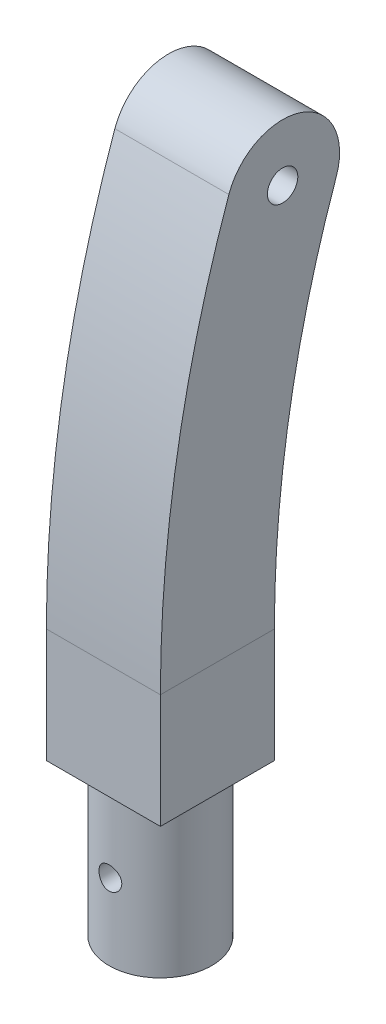
ISO-10303-21;
HEADER;
FILE_DESCRIPTION(('STEP AP214'),'2;1');
FILE_NAME('part.step','',(''),(''),'','','');
FILE_SCHEMA(('AUTOMOTIVE_DESIGN { 1 0 10303 214 1 1 1 1 }'));
ENDSEC;
DATA;
#1=APPLICATION_CONTEXT('core data for automotive mechanical design processes');
#2=APPLICATION_PROTOCOL_DEFINITION('international standard','automotive_design',2000,#1);
#3=PRODUCT_CONTEXT('',#1,'mechanical');
#4=PRODUCT('Part','Part','',(#3));
#5=PRODUCT_RELATED_PRODUCT_CATEGORY('part','',(#4));
#6=PRODUCT_DEFINITION_FORMATION('','',#4);
#7=PRODUCT_DEFINITION_CONTEXT('part definition',#1,'design');
#8=PRODUCT_DEFINITION('design','',#6,#7);
#9=PRODUCT_DEFINITION_SHAPE('','',#8);
#10=(LENGTH_UNIT() NAMED_UNIT(*) SI_UNIT(.MILLI.,.METRE.));
#11=(NAMED_UNIT(*) PLANE_ANGLE_UNIT() SI_UNIT($,.RADIAN.));
#12=(NAMED_UNIT(*) SI_UNIT($,.STERADIAN.) SOLID_ANGLE_UNIT());
#13=UNCERTAINTY_MEASURE_WITH_UNIT(LENGTH_MEASURE(1.E-05),#10,'distance_accuracy_value','');
#14=(GEOMETRIC_REPRESENTATION_CONTEXT(3) GLOBAL_UNCERTAINTY_ASSIGNED_CONTEXT((#13)) GLOBAL_UNIT_ASSIGNED_CONTEXT((#10,
#11,#12)) REPRESENTATION_CONTEXT('',''));
#15=CARTESIAN_POINT('',(0.,0.,0.));
#16=DIRECTION('',(0.,0.,1.));
#17=DIRECTION('',(1.,0.,0.));
#18=AXIS2_PLACEMENT_3D('',#15,#16,#17);
#19=CARTESIAN_POINT('',(0.,0.,0.));
#20=DIRECTION('',(0.,-1.,0.));
#21=DIRECTION('',(0.,0.,-1.));
#22=AXIS2_PLACEMENT_3D('',#19,#20,#21);
#23=PLANE('',#22);
#24=CARTESIAN_POINT('',(0.,0.,0.));
#25=DIRECTION('',(0.,-1.,0.));
#26=DIRECTION('',(0.,0.,-1.));
#27=AXIS2_PLACEMENT_3D('',#24,#25,#26);
#28=CIRCLE('',#27,13.5);
#29=CARTESIAN_POINT('',(0.,0.,-13.5));
#30=VERTEX_POINT('',#29);
#31=EDGE_CURVE('E11',#30,#30,#28,.T.);
#32=ORIENTED_EDGE('',*,*,#31,.F.);
#33=EDGE_LOOP('',(#32));
#34=FACE_BOUND('',#33,.T.);
#35=DIRECTION('',(0.,0.,-1.));
#36=VECTOR('',#35,1.);
#37=CARTESIAN_POINT('',(15.,0.,15.));
#38=LINE('',#37,#36);
#39=CARTESIAN_POINT('',(15.,0.,15.));
#40=VERTEX_POINT('',#39);
#41=CARTESIAN_POINT('',(15.,0.,-15.));
#42=VERTEX_POINT('',#41);
#43=EDGE_CURVE('E123',#40,#42,#38,.T.);
#44=ORIENTED_EDGE('',*,*,#43,.F.);
#45=DIRECTION('',(1.,0.,0.));
#46=VECTOR('',#45,1.);
#47=CARTESIAN_POINT('',(-15.,0.,15.));
#48=LINE('',#47,#46);
#49=CARTESIAN_POINT('',(-15.,0.,15.));
#50=VERTEX_POINT('',#49);
#51=EDGE_CURVE('E135',#50,#40,#48,.T.);
#52=ORIENTED_EDGE('',*,*,#51,.F.);
#53=DIRECTION('',(0.,0.,1.));
#54=VECTOR('',#53,1.);
#55=CARTESIAN_POINT('',(-15.,0.,15.));
#56=LINE('',#55,#54);
#57=CARTESIAN_POINT('',(-15.,0.,-15.));
#58=VERTEX_POINT('',#57);
#59=EDGE_CURVE('E88',#58,#50,#56,.T.);
#60=ORIENTED_EDGE('',*,*,#59,.F.);
#61=DIRECTION('',(-1.,0.,0.));
#62=VECTOR('',#61,1.);
#63=CARTESIAN_POINT('',(-15.,0.,-15.));
#64=LINE('',#63,#62);
#65=EDGE_CURVE('E92',#42,#58,#64,.T.);
#66=ORIENTED_EDGE('',*,*,#65,.F.);
#67=EDGE_LOOP('',(#44,#52,#60,#66));
#68=FACE_BOUND('',#67,.T.);
#69=ADVANCED_FACE('F33',(#34,#68),#23,.T.);
#70=CARTESIAN_POINT('',(15.,0.,15.));
#71=DIRECTION('',(1.,0.,0.));
#72=DIRECTION('',(0.,0.,-1.));
#73=AXIS2_PLACEMENT_3D('',#70,#71,#72);
#74=PLANE('',#73);
#75=DIRECTION('',(0.,1.,0.));
#76=VECTOR('',#75,1.);
#77=CARTESIAN_POINT('',(15.,0.,-15.));
#78=LINE('',#77,#76);
#79=CARTESIAN_POINT('',(15.,30.,-15.));
#80=VERTEX_POINT('',#79);
#81=EDGE_CURVE('E128',#42,#80,#78,.T.);
#82=ORIENTED_EDGE('',*,*,#81,.T.);
#83=DIRECTION('',(0.,0.,-1.));
#84=VECTOR('',#83,1.);
#85=CARTESIAN_POINT('',(15.,30.,15.));
#86=LINE('',#85,#84);
#87=CARTESIAN_POINT('',(15.,30.,15.));
#88=VERTEX_POINT('',#87);
#89=EDGE_CURVE('E126',#88,#80,#86,.T.);
#90=ORIENTED_EDGE('',*,*,#89,.F.);
#91=DIRECTION('',(0.,1.,0.));
#92=VECTOR('',#91,1.);
#93=CARTESIAN_POINT('',(15.,0.,15.));
#94=LINE('',#93,#92);
#95=EDGE_CURVE('E129',#40,#88,#94,.T.);
#96=ORIENTED_EDGE('',*,*,#95,.F.);
#97=ORIENTED_EDGE('',*,*,#43,.T.);
#98=EDGE_LOOP('',(#82,#90,#96,#97));
#99=FACE_BOUND('',#98,.T.);
#100=ADVANCED_FACE('F158',(#99),#74,.T.);
#101=CARTESIAN_POINT('',(-15.,0.,-15.));
#102=DIRECTION('',(0.,0.,-1.));
#103=DIRECTION('',(-1.,0.,0.));
#104=AXIS2_PLACEMENT_3D('',#101,#102,#103);
#105=PLANE('',#104);
#106=DIRECTION('',(0.,1.,0.));
#107=VECTOR('',#106,1.);
#108=CARTESIAN_POINT('',(-15.,0.,-15.));
#109=LINE('',#108,#107);
#110=CARTESIAN_POINT('',(-15.,30.,-15.));
#111=VERTEX_POINT('',#110);
#112=EDGE_CURVE('E140',#58,#111,#109,.T.);
#113=ORIENTED_EDGE('',*,*,#112,.T.);
#114=DIRECTION('',(-1.,0.,0.));
#115=VECTOR('',#114,1.);
#116=CARTESIAN_POINT('',(-15.,30.,-15.));
#117=LINE('',#116,#115);
#118=EDGE_CURVE('E132',#80,#111,#117,.T.);
#119=ORIENTED_EDGE('',*,*,#118,.F.);
#120=ORIENTED_EDGE('',*,*,#81,.F.);
#121=ORIENTED_EDGE('',*,*,#65,.T.);
#122=EDGE_LOOP('',(#113,#119,#120,#121));
#123=FACE_BOUND('',#122,.T.);
#124=ADVANCED_FACE('F161',(#123),#105,.T.);
#125=CARTESIAN_POINT('',(-15.,0.,15.));
#126=DIRECTION('',(-1.,0.,0.));
#127=DIRECTION('',(0.,0.,1.));
#128=AXIS2_PLACEMENT_3D('',#125,#126,#127);
#129=PLANE('',#128);
#130=DIRECTION('',(0.,1.,0.));
#131=VECTOR('',#130,1.);
#132=CARTESIAN_POINT('',(-15.,0.,15.));
#133=LINE('',#132,#131);
#134=CARTESIAN_POINT('',(-15.,30.,15.));
#135=VERTEX_POINT('',#134);
#136=EDGE_CURVE('E148',#50,#135,#133,.T.);
#137=ORIENTED_EDGE('',*,*,#136,.T.);
#138=DIRECTION('',(0.,0.,1.));
#139=VECTOR('',#138,1.);
#140=CARTESIAN_POINT('',(-15.,30.,15.));
#141=LINE('',#140,#139);
#142=EDGE_CURVE('E143',#111,#135,#141,.T.);
#143=ORIENTED_EDGE('',*,*,#142,.F.);
#144=ORIENTED_EDGE('',*,*,#112,.F.);
#145=ORIENTED_EDGE('',*,*,#59,.T.);
#146=EDGE_LOOP('',(#137,#143,#144,#145));
#147=FACE_BOUND('',#146,.T.);
#148=ADVANCED_FACE('F187',(#147),#129,.T.);
#149=CARTESIAN_POINT('',(-15.,0.,15.));
#150=DIRECTION('',(0.,0.,1.));
#151=DIRECTION('',(1.,0.,0.));
#152=AXIS2_PLACEMENT_3D('',#149,#150,#151);
#153=PLANE('',#152);
#154=DIRECTION('',(1.,0.,0.));
#155=VECTOR('',#154,1.);
#156=CARTESIAN_POINT('',(-15.,30.,15.));
#157=LINE('',#156,#155);
#158=EDGE_CURVE('E99',#135,#88,#157,.T.);
#159=ORIENTED_EDGE('',*,*,#158,.F.);
#160=ORIENTED_EDGE('',*,*,#136,.F.);
#161=ORIENTED_EDGE('',*,*,#51,.T.);
#162=ORIENTED_EDGE('',*,*,#95,.T.);
#163=EDGE_LOOP('',(#159,#160,#161,#162));
#164=FACE_BOUND('',#163,.T.);
#165=ADVANCED_FACE('F156',(#164),#153,.T.);
#166=CARTESIAN_POINT('',(15.,30.,15.));
#167=DIRECTION('',(1.,0.,0.));
#168=DIRECTION('',(0.,0.,-1.));
#169=AXIS2_PLACEMENT_3D('',#166,#167,#168);
#170=PLANE('',#169);
#171=CARTESIAN_POINT('',(15.,130.,-17.157287525381));
#172=DIRECTION('',(1.,0.,0.));
#173=DIRECTION('',(0.,0.,-1.));
#174=AXIS2_PLACEMENT_3D('',#171,#172,#173);
#175=CIRCLE('',#174,4.);
#176=CARTESIAN_POINT('',(15.,130.,-21.157287525381));
#177=VERTEX_POINT('',#176);
#178=EDGE_CURVE('E113',#177,#177,#175,.T.);
#179=ORIENTED_EDGE('',*,*,#178,.F.);
#180=EDGE_LOOP('',(#179));
#181=FACE_BOUND('',#180,.T.);
#182=CARTESIAN_POINT('',(15.,30.,-300.));
#183=DIRECTION('',(-1.,0.,0.));
#184=DIRECTION('',(0.,0.,1.));
#185=AXIS2_PLACEMENT_3D('',#182,#183,#184);
#186=CIRCLE('',#185,285.);
#187=CARTESIAN_POINT('',(15.,125.,-31.2994231491119));
#188=VERTEX_POINT('',#187);
#189=EDGE_CURVE('E78',#80,#188,#186,.T.);
#190=ORIENTED_EDGE('',*,*,#189,.T.);
#191=CARTESIAN_POINT('',(15.,130.,-17.157287525381));
#192=DIRECTION('',(1.,0.,0.));
#193=DIRECTION('',(0.,0.,-1.));
#194=AXIS2_PLACEMENT_3D('',#191,#192,#193);
#195=CIRCLE('',#194,15.);
#196=CARTESIAN_POINT('',(15.,135.,-3.01515190165003));
#197=VERTEX_POINT('',#196);
#198=EDGE_CURVE('E110',#188,#197,#195,.T.);
#199=ORIENTED_EDGE('',*,*,#198,.T.);
#200=CARTESIAN_POINT('',(15.,30.,-300.));
#201=DIRECTION('',(-1.,0.,0.));
#202=DIRECTION('',(0.,0.,1.));
#203=AXIS2_PLACEMENT_3D('',#200,#201,#202);
#204=CIRCLE('',#203,315.);
#205=EDGE_CURVE('E97',#88,#197,#204,.T.);
#206=ORIENTED_EDGE('',*,*,#205,.F.);
#207=ORIENTED_EDGE('',*,*,#89,.T.);
#208=EDGE_LOOP('',(#190,#199,#206,#207));
#209=FACE_BOUND('',#208,.T.);
#210=ADVANCED_FACE('F112',(#181,#209),#170,.T.);
#211=CARTESIAN_POINT('',(0.,30.,-300.));
#212=DIRECTION('',(-1.,0.,0.));
#213=DIRECTION('',(0.,0.,1.));
#214=AXIS2_PLACEMENT_3D('',#211,#212,#213);
#215=CYLINDRICAL_SURFACE('',#214,285.);
#216=CARTESIAN_POINT('',(-15.,30.,-300.));
#217=DIRECTION('',(-1.,0.,0.));
#218=DIRECTION('',(0.,0.,1.));
#219=AXIS2_PLACEMENT_3D('',#216,#217,#218);
#220=CIRCLE('',#219,285.);
#221=CARTESIAN_POINT('',(-15.,125.,-31.2994231491119));
#222=VERTEX_POINT('',#221);
#223=EDGE_CURVE('E56',#111,#222,#220,.T.);
#224=ORIENTED_EDGE('',*,*,#223,.T.);
#225=DIRECTION('',(-1.,0.,0.));
#226=VECTOR('',#225,1.);
#227=CARTESIAN_POINT('',(-15.,125.,-31.2994231491119));
#228=LINE('',#227,#226);
#229=EDGE_CURVE('E136',#188,#222,#228,.T.);
#230=ORIENTED_EDGE('',*,*,#229,.F.);
#231=ORIENTED_EDGE('',*,*,#189,.F.);
#232=ORIENTED_EDGE('',*,*,#118,.T.);
#233=EDGE_LOOP('',(#224,#230,#231,#232));
#234=FACE_BOUND('',#233,.T.);
#235=ADVANCED_FACE('F163',(#234),#215,.F.);
#236=CARTESIAN_POINT('',(-15.,30.,15.));
#237=DIRECTION('',(-1.,0.,0.));
#238=DIRECTION('',(0.,0.,1.));
#239=AXIS2_PLACEMENT_3D('',#236,#237,#238);
#240=PLANE('',#239);
#241=CARTESIAN_POINT('',(-15.,130.,-17.157287525381));
#242=DIRECTION('',(-1.,0.,0.));
#243=DIRECTION('',(0.,0.,1.));
#244=AXIS2_PLACEMENT_3D('',#241,#242,#243);
#245=CIRCLE('',#244,4.);
#246=CARTESIAN_POINT('',(-15.,130.,-13.157287525381));
#247=VERTEX_POINT('',#246);
#248=EDGE_CURVE('E118',#247,#247,#245,.F.);
#249=ORIENTED_EDGE('',*,*,#248,.T.);
#250=EDGE_LOOP('',(#249));
#251=FACE_BOUND('',#250,.T.);
#252=CARTESIAN_POINT('',(-15.,30.,-300.));
#253=DIRECTION('',(-1.,0.,0.));
#254=DIRECTION('',(0.,0.,1.));
#255=AXIS2_PLACEMENT_3D('',#252,#253,#254);
#256=CIRCLE('',#255,315.);
#257=CARTESIAN_POINT('',(-15.,135.,-3.01515190165003));
#258=VERTEX_POINT('',#257);
#259=EDGE_CURVE('E69',#135,#258,#256,.T.);
#260=ORIENTED_EDGE('',*,*,#259,.T.);
#261=CARTESIAN_POINT('',(-15.,130.,-17.157287525381));
#262=DIRECTION('',(-1.,0.,0.));
#263=DIRECTION('',(0.,0.,1.));
#264=AXIS2_PLACEMENT_3D('',#261,#262,#263);
#265=CIRCLE('',#264,15.);
#266=EDGE_CURVE('E111',#222,#258,#265,.F.);
#267=ORIENTED_EDGE('',*,*,#266,.F.);
#268=ORIENTED_EDGE('',*,*,#223,.F.);
#269=ORIENTED_EDGE('',*,*,#142,.T.);
#270=EDGE_LOOP('',(#260,#267,#268,#269));
#271=FACE_BOUND('',#270,.T.);
#272=ADVANCED_FACE('F165',(#251,#271),#240,.T.);
#273=CARTESIAN_POINT('',(0.,30.,-300.));
#274=DIRECTION('',(-1.,0.,0.));
#275=DIRECTION('',(0.,0.,1.));
#276=AXIS2_PLACEMENT_3D('',#273,#274,#275);
#277=CYLINDRICAL_SURFACE('',#276,315.);
#278=DIRECTION('',(1.,0.,0.));
#279=VECTOR('',#278,1.);
#280=CARTESIAN_POINT('',(-15.,135.,-3.01515190165003));
#281=LINE('',#280,#279);
#282=EDGE_CURVE('E36',#258,#197,#281,.T.);
#283=ORIENTED_EDGE('',*,*,#282,.F.);
#284=ORIENTED_EDGE('',*,*,#259,.F.);
#285=ORIENTED_EDGE('',*,*,#158,.T.);
#286=ORIENTED_EDGE('',*,*,#205,.T.);
#287=EDGE_LOOP('',(#283,#284,#285,#286));
#288=FACE_BOUND('',#287,.T.);
#289=ADVANCED_FACE('F98',(#288),#277,.T.);
#290=CARTESIAN_POINT('',(0.,-40.,0.));
#291=DIRECTION('',(0.,1.,0.));
#292=DIRECTION('',(0.,0.,1.));
#293=AXIS2_PLACEMENT_3D('',#290,#291,#292);
#294=CYLINDRICAL_SURFACE('',#293,13.5);
#295=CARTESIAN_POINT('',(3.,-20.,13.1624465810882));
#296=CARTESIAN_POINT('',(2.99999437421922,-19.833736448426,13.162449939686));
#297=CARTESIAN_POINT('',(2.98613119718498,-19.6674058810123,13.1656311803976));
#298=CARTESIAN_POINT('',(2.93110835499428,-19.3394797608667,13.1779880857712));
#299=CARTESIAN_POINT('',(2.88992936552138,-19.177887644876,13.1871679940659));
#300=CARTESIAN_POINT('',(2.78163957468419,-18.8642293665955,13.2104323856515));
#301=CARTESIAN_POINT('',(2.71455775200915,-18.7121527789994,13.2245113863689));
#302=CARTESIAN_POINT('',(2.55645005152967,-18.4214074894143,13.2559809946233));
#303=CARTESIAN_POINT('',(2.46542450423718,-18.2827386023856,13.2733715564475));
#304=CARTESIAN_POINT('',(2.26032161188685,-18.0203261429474,13.3098435492506));
#305=CARTESIAN_POINT('',(2.1459055466883,-17.8968503568204,13.3289471973885));
#306=CARTESIAN_POINT('',(1.89800051829547,-17.6706758713415,13.3664985517074));
#307=CARTESIAN_POINT('',(1.76451004412277,-17.5679788195345,13.3849462057791));
#308=CARTESIAN_POINT('',(1.48044591785635,-17.385213872907,13.4193493920259));
#309=CARTESIAN_POINT('',(1.32970232479962,-17.3054041258203,13.4352756511115));
#310=CARTESIAN_POINT('',(1.01652950347792,-17.1723502974193,13.4625903650323));
#311=CARTESIAN_POINT('',(0.854101632010432,-17.1191031372935,13.4739793457426));
#312=CARTESIAN_POINT('',(0.524956194492505,-17.0415298505917,13.4907792670088));
#313=CARTESIAN_POINT('',(0.358350342392886,-17.0167503361994,13.496283823904));
#314=CARTESIAN_POINT('',(0.0232614866790374,-16.9953975936914,13.5010192342806));
#315=CARTESIAN_POINT('',(-0.145221293214815,-16.9988210390993,13.5002508276442));
#316=CARTESIAN_POINT('',(-0.476153881401518,-17.033440583744,13.4925982402692));
#317=CARTESIAN_POINT('',(-0.638657676490727,-17.0641479186366,13.4858216940701));
#318=CARTESIAN_POINT('',(-0.956146268315124,-17.1516840013327,13.4670371595346));
#319=CARTESIAN_POINT('',(-1.11113071761421,-17.2085139548799,13.4550289297203));
#320=CARTESIAN_POINT('',(-1.41053065408639,-17.3471104611514,13.4269580790848));
#321=CARTESIAN_POINT('',(-1.55485803134103,-17.4290610748167,13.4108656882919));
#322=CARTESIAN_POINT('',(-1.82788970481721,-17.6154351409235,13.3763890752603));
#323=CARTESIAN_POINT('',(-1.9565918049443,-17.7198617466049,13.3580045315994));
#324=CARTESIAN_POINT('',(-2.19762748437124,-17.9508802907794,13.3204974859024));
#325=CARTESIAN_POINT('',(-2.30955032771432,-18.0778999639563,13.3013676144021));
#326=CARTESIAN_POINT('',(-2.51058454530819,-18.3491041214256,13.2648948216275));
#327=CARTESIAN_POINT('',(-2.5996952602322,-18.4932891016614,13.2475519520106));
#328=CARTESIAN_POINT('',(-2.75276648873958,-18.795409832523,13.2165965034763));
#329=CARTESIAN_POINT('',(-2.81664716161095,-18.953387334207,13.2029958072444));
#330=CARTESIAN_POINT('',(-2.91682904284752,-19.2782092569234,13.1812277113555));
#331=CARTESIAN_POINT('',(-2.95313478255712,-19.445052216286,13.1730594190277));
#332=CARTESIAN_POINT('',(-2.99649448350305,-19.7791099805896,13.1632636274194));
#333=CARTESIAN_POINT('',(-3.00414748151695,-19.9462431965598,13.1615022037629));
#334=CARTESIAN_POINT('',(-2.9916082113652,-20.2793973844439,13.1643579678824));
#335=CARTESIAN_POINT('',(-2.97141792281369,-20.4454184345877,13.1689747021814));
#336=CARTESIAN_POINT('',(-2.90428555984044,-20.7695353062449,13.1839399241269));
#337=CARTESIAN_POINT('',(-2.8576753898165,-20.9277034629444,13.1942172550355));
#338=CARTESIAN_POINT('',(-2.73938662708086,-21.233984946693,13.2192811275877));
#339=CARTESIAN_POINT('',(-2.66770557165019,-21.3820972842492,13.2340681121974));
#340=CARTESIAN_POINT('',(-2.49999705249822,-21.6666494026646,13.2667781107747));
#341=CARTESIAN_POINT('',(-2.40360171706266,-21.8028669724776,13.2847471146597));
#342=CARTESIAN_POINT('',(-2.18968056440659,-22.057412536113,13.3216761301978));
#343=CARTESIAN_POINT('',(-2.0721520342964,-22.1757382295429,13.3406362688621));
#344=CARTESIAN_POINT('',(-1.81658582192193,-22.3934770152629,13.3778540089087));
#345=CARTESIAN_POINT('',(-1.67819611475441,-22.4924810538042,13.3960909909727));
#346=CARTESIAN_POINT('',(-1.38640224321388,-22.665836201351,13.4294236716516));
#347=CARTESIAN_POINT('',(-1.23299879221959,-22.7401884809502,13.4445195194113));
#348=CARTESIAN_POINT('',(-0.916502850004943,-22.8615651719501,13.4697823307937));
#349=CARTESIAN_POINT('',(-0.75348058226161,-22.9087657938412,13.4799810032788));
#350=CARTESIAN_POINT('',(-0.421567630193387,-22.9750477400248,13.4944376504927));
#351=CARTESIAN_POINT('',(-0.252677831887782,-22.9941332910708,13.4986965181926));
#352=CARTESIAN_POINT('',(0.0822972683105562,-23.0034481735534,13.5007661280042));
#353=CARTESIAN_POINT('',(0.248365058604294,-22.9942874459889,13.4987131684573));
#354=CARTESIAN_POINT('',(0.576531062049224,-22.9487375741649,13.4886828969468));
#355=CARTESIAN_POINT('',(0.738629351014932,-22.9123489503575,13.480705698223));
#356=CARTESIAN_POINT('',(1.05376542717996,-22.8136724642079,13.4597345559667));
#357=CARTESIAN_POINT('',(1.20683232396081,-22.7514736641489,13.4467578748893));
#358=CARTESIAN_POINT('',(1.50043729213955,-22.6030282946908,13.4171713097671));
#359=CARTESIAN_POINT('',(1.64097410368605,-22.5167793107297,13.4005610609598));
#360=CARTESIAN_POINT('',(1.90849634926497,-22.3207065838054,13.365112239233));
#361=CARTESIAN_POINT('',(2.03516363758941,-22.2104554464658,13.3462364922944));
#362=CARTESIAN_POINT('',(2.26840759852962,-21.9703667953215,13.3085806076653));
#363=CARTESIAN_POINT('',(2.37497939998718,-21.8405245463149,13.2898004942272));
#364=CARTESIAN_POINT('',(2.56643776712976,-21.5627682503181,13.2541705524972));
#365=CARTESIAN_POINT('',(2.65100228786962,-21.414628074889,13.2373511866028));
#366=CARTESIAN_POINT('',(2.79390039487,-21.1058946569433,13.2079326027974));
#367=CARTESIAN_POINT('',(2.85225586159949,-20.9453119338415,13.195329866909));
#368=CARTESIAN_POINT('',(2.93084024198602,-20.6538402889171,13.1780643261061));
#369=CARTESIAN_POINT('',(2.95672473071977,-20.5245148590898,13.1722470677159));
#370=CARTESIAN_POINT('',(2.99130639255913,-20.2634735651297,13.1644369637272));
#371=CARTESIAN_POINT('',(3.00000445822692,-20.1317578254943,13.1624439195214));
#372=CARTESIAN_POINT('',(3.,-20.,13.1624465810882));
#373=B_SPLINE_CURVE_WITH_KNOTS('',3,(#295,#296,#297,#298,#299,#300,#301,#302,#303,#304,#305,
#306,#307,#308,#309,#310,#311,#312,#313,#314,#315,#316,#317,#318,#319,#320,#321,#322,#323,#324,
#325,#326,#327,#328,#329,#330,#331,#332,#333,#334,#335,#336,#337,#338,#339,#340,#341,#342,#343,
#344,#345,#346,#347,#348,#349,#350,#351,#352,#353,#354,#355,#356,#357,#358,#359,#360,#361,#362,
#363,#364,#365,#366,#367,#368,#369,#370,#371,#372),.UNSPECIFIED.,.T.,.F.,(4,2,2,2,2,2,2,2,2,2,2,
2,2,2,2,2,2,2,2,2,2,2,2,2,2,2,2,2,2,2,2,2,2,2,2,2,2,2,4),(0.,0.498307675530976,
0.996968250668841,1.49507256011671,1.99316999424372,2.49906890879464,3.00500792034452,
3.51644718964213,4.027827165349,4.53094457218484,5.03400263829122,5.52822662761369,
6.02247343116045,6.52043187009742,7.0184602150513,7.52718070946972,8.03591590550602,
8.54624834175488,9.05649689774055,9.55601624274951,10.0555000745451,10.5488438692604,
11.0422361388693,11.5434484309065,12.0447251100686,12.555675690653,13.0666020051728,
13.5741739418345,14.081669563536,14.5782838134789,15.0748885710504,15.56979377669,
16.0647486871406,16.5693670418218,17.0741075594952,17.5858645730318,18.0971935515557,
18.4921047944898,18.8869955275069),.UNSPECIFIED.);
#374=CARTESIAN_POINT('',(3.,-20.,13.1624465810882));
#375=VERTEX_POINT('',#374);
#376=EDGE_CURVE('E215',#375,#375,#373,.T.);
#377=ORIENTED_EDGE('',*,*,#376,.F.);
#378=EDGE_LOOP('',(#377));
#379=FACE_BOUND('',#378,.T.);
#380=CARTESIAN_POINT('',(3.,-20.,-13.1624465810882));
#381=CARTESIAN_POINT('',(2.99999437421922,-20.166263551574,-13.162449939686));
#382=CARTESIAN_POINT('',(2.98613119718498,-20.3325941189877,-13.1656311803976));
#383=CARTESIAN_POINT('',(2.93110835499428,-20.6605202391333,-13.1779880857712));
#384=CARTESIAN_POINT('',(2.88992936552138,-20.822112355124,-13.1871679940659));
#385=CARTESIAN_POINT('',(2.78163957468419,-21.1357706334045,-13.2104323856515));
#386=CARTESIAN_POINT('',(2.71455775200915,-21.2878472210006,-13.2245113863689));
#387=CARTESIAN_POINT('',(2.55645005152967,-21.5785925105857,-13.2559809946233));
#388=CARTESIAN_POINT('',(2.46542450423718,-21.7172613976144,-13.2733715564475));
#389=CARTESIAN_POINT('',(2.26032161188685,-21.9796738570526,-13.3098435492506));
#390=CARTESIAN_POINT('',(2.1459055466883,-22.1031496431796,-13.3289471973885));
#391=CARTESIAN_POINT('',(1.89800051829547,-22.3293241286585,-13.3664985517074));
#392=CARTESIAN_POINT('',(1.76451004412277,-22.4320211804655,-13.3849462057791));
#393=CARTESIAN_POINT('',(1.48044591785635,-22.614786127093,-13.4193493920259));
#394=CARTESIAN_POINT('',(1.32970232479962,-22.6945958741797,-13.4352756511115));
#395=CARTESIAN_POINT('',(1.01652950347792,-22.8276497025807,-13.4625903650323));
#396=CARTESIAN_POINT('',(0.854101632010432,-22.8808968627065,-13.4739793457426));
#397=CARTESIAN_POINT('',(0.524956194492505,-22.9584701494083,-13.4907792670088));
#398=CARTESIAN_POINT('',(0.358350342392885,-22.9832496638006,-13.496283823904));
#399=CARTESIAN_POINT('',(0.0232614866790372,-23.0046024063086,-13.5010192342806));
#400=CARTESIAN_POINT('',(-0.145221293214815,-23.0011789609007,-13.5002508276442));
#401=CARTESIAN_POINT('',(-0.476153881401518,-22.966559416256,-13.4925982402692));
#402=CARTESIAN_POINT('',(-0.638657676490727,-22.9358520813634,-13.4858216940701));
#403=CARTESIAN_POINT('',(-0.956146268315123,-22.8483159986673,-13.4670371595346));
#404=CARTESIAN_POINT('',(-1.11113071761421,-22.7914860451201,-13.4550289297203));
#405=CARTESIAN_POINT('',(-1.4105306540864,-22.6528895388486,-13.4269580790848));
#406=CARTESIAN_POINT('',(-1.55485803134103,-22.5709389251833,-13.4108656882919));
#407=CARTESIAN_POINT('',(-1.82788970481721,-22.3845648590765,-13.3763890752603));
#408=CARTESIAN_POINT('',(-1.9565918049443,-22.2801382533951,-13.3580045315994));
#409=CARTESIAN_POINT('',(-2.19762748437124,-22.0491197092206,-13.3204974859024));
#410=CARTESIAN_POINT('',(-2.30955032771432,-21.9221000360437,-13.3013676144021));
#411=CARTESIAN_POINT('',(-2.51058454530819,-21.6508958785744,-13.2648948216275));
#412=CARTESIAN_POINT('',(-2.5996952602322,-21.5067108983386,-13.2475519520106));
#413=CARTESIAN_POINT('',(-2.75276648873958,-21.204590167477,-13.2165965034763));
#414=CARTESIAN_POINT('',(-2.81664716161095,-21.046612665793,-13.2029958072444));
#415=CARTESIAN_POINT('',(-2.91682904284752,-20.7217907430766,-13.1812277113555));
#416=CARTESIAN_POINT('',(-2.95313478255712,-20.554947783714,-13.1730594190277));
#417=CARTESIAN_POINT('',(-2.99649448350305,-20.2208900194104,-13.1632636274194));
#418=CARTESIAN_POINT('',(-3.00414748151695,-20.0537568034402,-13.1615022037629));
#419=CARTESIAN_POINT('',(-2.9916082113652,-19.7206026155562,-13.1643579678824));
#420=CARTESIAN_POINT('',(-2.97141792281368,-19.5545815654123,-13.1689747021814));
#421=CARTESIAN_POINT('',(-2.90428555984044,-19.2304646937551,-13.1839399241269));
#422=CARTESIAN_POINT('',(-2.8576753898165,-19.0722965370556,-13.1942172550355));
#423=CARTESIAN_POINT('',(-2.73938662708086,-18.766015053307,-13.2192811275877));
#424=CARTESIAN_POINT('',(-2.66770557165019,-18.6179027157508,-13.2340681121974));
#425=CARTESIAN_POINT('',(-2.49999705249822,-18.3333505973354,-13.2667781107747));
#426=CARTESIAN_POINT('',(-2.40360171706266,-18.1971330275224,-13.2847471146597));
#427=CARTESIAN_POINT('',(-2.18968056440659,-17.942587463887,-13.3216761301978));
#428=CARTESIAN_POINT('',(-2.0721520342964,-17.8242617704571,-13.3406362688621));
#429=CARTESIAN_POINT('',(-1.81658582192193,-17.6065229847371,-13.3778540089087));
#430=CARTESIAN_POINT('',(-1.67819611475441,-17.5075189461958,-13.3960909909727));
#431=CARTESIAN_POINT('',(-1.38640224321388,-17.334163798649,-13.4294236716516));
#432=CARTESIAN_POINT('',(-1.23299879221959,-17.2598115190498,-13.4445195194113));
#433=CARTESIAN_POINT('',(-0.916502850004943,-17.1384348280499,-13.4697823307937));
#434=CARTESIAN_POINT('',(-0.753480582261611,-17.0912342061588,-13.4799810032788));
#435=CARTESIAN_POINT('',(-0.421567630193387,-17.0249522599752,-13.4944376504927));
#436=CARTESIAN_POINT('',(-0.252677831887782,-17.0058667089292,-13.4986965181926));
#437=CARTESIAN_POINT('',(0.0822972683105561,-16.9965518264466,-13.5007661280042));
#438=CARTESIAN_POINT('',(0.248365058604294,-17.0057125540111,-13.4987131684573));
#439=CARTESIAN_POINT('',(0.576531062049224,-17.0512624258351,-13.4886828969468));
#440=CARTESIAN_POINT('',(0.738629351014932,-17.0876510496425,-13.480705698223));
#441=CARTESIAN_POINT('',(1.05376542717996,-17.1863275357921,-13.4597345559667));
#442=CARTESIAN_POINT('',(1.20683232396081,-17.2485263358511,-13.4467578748893));
#443=CARTESIAN_POINT('',(1.50043729213955,-17.3969717053092,-13.4171713097671));
#444=CARTESIAN_POINT('',(1.64097410368605,-17.4832206892703,-13.4005610609598));
#445=CARTESIAN_POINT('',(1.90849634926497,-17.6792934161946,-13.365112239233));
#446=CARTESIAN_POINT('',(2.03516363758941,-17.7895445535342,-13.3462364922944));
#447=CARTESIAN_POINT('',(2.26840759852962,-18.0296332046785,-13.3085806076653));
#448=CARTESIAN_POINT('',(2.37497939998718,-18.1594754536851,-13.2898004942272));
#449=CARTESIAN_POINT('',(2.56643776712976,-18.4372317496819,-13.2541705524972));
#450=CARTESIAN_POINT('',(2.65100228786962,-18.585371925111,-13.2373511866028));
#451=CARTESIAN_POINT('',(2.79390039487,-18.8941053430567,-13.2079326027974));
#452=CARTESIAN_POINT('',(2.85225586159949,-19.0546880661585,-13.195329866909));
#453=CARTESIAN_POINT('',(2.93084024198602,-19.3461597110829,-13.1780643261061));
#454=CARTESIAN_POINT('',(2.95672473071977,-19.4754851409102,-13.1722470677159));
#455=CARTESIAN_POINT('',(2.99130639255913,-19.7365264348703,-13.1644369637272));
#456=CARTESIAN_POINT('',(3.00000445822692,-19.8682421745057,-13.1624439195214));
#457=CARTESIAN_POINT('',(3.,-20.,-13.1624465810882));
#458=B_SPLINE_CURVE_WITH_KNOTS('',3,(#380,#381,#382,#383,#384,#385,#386,#387,#388,#389,#390,
#391,#392,#393,#394,#395,#396,#397,#398,#399,#400,#401,#402,#403,#404,#405,#406,#407,#408,#409,
#410,#411,#412,#413,#414,#415,#416,#417,#418,#419,#420,#421,#422,#423,#424,#425,#426,#427,#428,
#429,#430,#431,#432,#433,#434,#435,#436,#437,#438,#439,#440,#441,#442,#443,#444,#445,#446,#447,
#448,#449,#450,#451,#452,#453,#454,#455,#456,#457),.UNSPECIFIED.,.T.,.F.,(4,2,2,2,2,2,2,2,2,2,2,
2,2,2,2,2,2,2,2,2,2,2,2,2,2,2,2,2,2,2,2,2,2,2,2,2,2,2,4),(0.,0.498307675530976,
0.996968250668841,1.49507256011671,1.99316999424372,2.49906890879464,3.00500792034452,
3.51644718964213,4.027827165349,4.53094457218484,5.03400263829122,5.52822662761368,
6.02247343116045,6.52043187009742,7.0184602150513,7.52718070946972,8.03591590550602,
8.54624834175487,9.05649689774055,9.5560162427495,10.0555000745451,10.5488438692604,
11.0422361388693,11.5434484309065,12.0447251100686,12.555675690653,13.0666020051728,
13.5741739418345,14.081669563536,14.5782838134789,15.0748885710504,15.56979377669,
16.0647486871406,16.5693670418218,17.0741075594952,17.5858645730318,18.0971935515557,
18.4921047944898,18.8869955275069),.UNSPECIFIED.);
#459=CARTESIAN_POINT('',(3.,-20.,-13.1624465810882));
#460=VERTEX_POINT('',#459);
#461=EDGE_CURVE('E220',#460,#460,#458,.T.);
#462=ORIENTED_EDGE('',*,*,#461,.F.);
#463=EDGE_LOOP('',(#462));
#464=FACE_BOUND('',#463,.T.);
#465=CARTESIAN_POINT('',(0.,-40.,0.));
#466=DIRECTION('',(0.,-1.,0.));
#467=DIRECTION('',(0.,0.,-1.));
#468=AXIS2_PLACEMENT_3D('',#465,#466,#467);
#469=CIRCLE('',#468,13.5);
#470=CARTESIAN_POINT('',(0.,-40.,-13.5));
#471=VERTEX_POINT('',#470);
#472=EDGE_CURVE('E115',#471,#471,#469,.T.);
#473=ORIENTED_EDGE('',*,*,#472,.F.);
#474=EDGE_LOOP('',(#473));
#475=FACE_BOUND('',#474,.T.);
#476=ORIENTED_EDGE('',*,*,#31,.T.);
#477=EDGE_LOOP('',(#476));
#478=FACE_BOUND('',#477,.T.);
#479=ADVANCED_FACE('F178',(#379,#464,#475,#478),#294,.T.);
#480=CARTESIAN_POINT('',(0.,-40.,0.));
#481=DIRECTION('',(0.,-1.,0.));
#482=DIRECTION('',(0.,0.,-1.));
#483=AXIS2_PLACEMENT_3D('',#480,#481,#482);
#484=PLANE('',#483);
#485=ORIENTED_EDGE('',*,*,#472,.T.);
#486=EDGE_LOOP('',(#485));
#487=FACE_BOUND('',#486,.T.);
#488=ADVANCED_FACE('F182',(#487),#484,.T.);
#489=CARTESIAN_POINT('',(-50.344929886929,130.,-17.157287525381));
#490=DIRECTION('',(1.,0.,0.));
#491=DIRECTION('',(0.,0.,-1.));
#492=AXIS2_PLACEMENT_3D('',#489,#490,#491);
#493=CYLINDRICAL_SURFACE('',#492,15.);
#494=ORIENTED_EDGE('',*,*,#229,.T.);
#495=ORIENTED_EDGE('',*,*,#266,.T.);
#496=ORIENTED_EDGE('',*,*,#282,.T.);
#497=ORIENTED_EDGE('',*,*,#198,.F.);
#498=EDGE_LOOP('',(#494,#495,#496,#497));
#499=FACE_BOUND('',#498,.T.);
#500=ADVANCED_FACE('F109',(#499),#493,.T.);
#501=CARTESIAN_POINT('',(-15.001,130.,-17.157287525381));
#502=DIRECTION('',(1.,0.,0.));
#503=DIRECTION('',(0.,0.,-1.));
#504=AXIS2_PLACEMENT_3D('',#501,#502,#503);
#505=CYLINDRICAL_SURFACE('',#504,4.);
#506=ORIENTED_EDGE('',*,*,#248,.F.);
#507=EDGE_LOOP('',(#506));
#508=FACE_BOUND('',#507,.T.);
#509=ORIENTED_EDGE('',*,*,#178,.T.);
#510=EDGE_LOOP('',(#509));
#511=FACE_BOUND('',#510,.T.);
#512=ADVANCED_FACE('F203',(#508,#511),#505,.F.);
#513=CARTESIAN_POINT('',(0.,-20.,-32.158287525381));
#514=DIRECTION('',(0.,0.,1.));
#515=DIRECTION('',(1.,0.,0.));
#516=AXIS2_PLACEMENT_3D('',#513,#514,#515);
#517=CYLINDRICAL_SURFACE('',#516,3.);
#518=ORIENTED_EDGE('',*,*,#376,.T.);
#519=EDGE_LOOP('',(#518));
#520=FACE_BOUND('',#519,.T.);
#521=ORIENTED_EDGE('',*,*,#461,.T.);
#522=EDGE_LOOP('',(#521));
#523=FACE_BOUND('',#522,.T.);
#524=ADVANCED_FACE('F206',(#520,#523),#517,.F.);
#525=CLOSED_SHELL('',(#69,#100,#124,#148,#165,#210,#235,#272,#289,#479,#488,#500,#512,#524));
#526=MANIFOLD_SOLID_BREP('B2',#525);
#527=ADVANCED_BREP_SHAPE_REPRESENTATION('',(#18,#526),#14);
#528=SHAPE_DEFINITION_REPRESENTATION(#9,#527);
ENDSEC;
END-ISO-10303-21;
